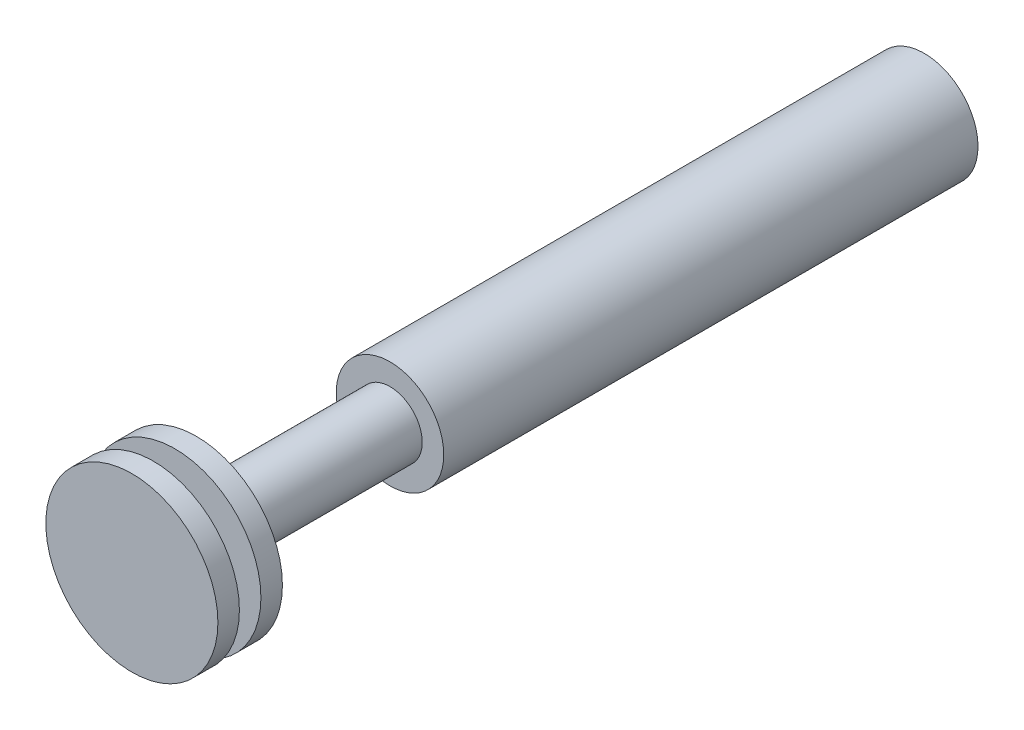
ISO-10303-21;
HEADER;
FILE_DESCRIPTION(('STEP AP214'),'2;1');
FILE_NAME('part.step','',(''),(''),'','','');
FILE_SCHEMA(('AUTOMOTIVE_DESIGN { 1 0 10303 214 1 1 1 1 }'));
ENDSEC;
DATA;
#1=APPLICATION_CONTEXT('core data for automotive mechanical design processes');
#2=APPLICATION_PROTOCOL_DEFINITION('international standard','automotive_design',2000,#1);
#3=PRODUCT_CONTEXT('',#1,'mechanical');
#4=PRODUCT('Part','Part','',(#3));
#5=PRODUCT_RELATED_PRODUCT_CATEGORY('part','',(#4));
#6=PRODUCT_DEFINITION_FORMATION('','',#4);
#7=PRODUCT_DEFINITION_CONTEXT('part definition',#1,'design');
#8=PRODUCT_DEFINITION('design','',#6,#7);
#9=PRODUCT_DEFINITION_SHAPE('','',#8);
#10=(LENGTH_UNIT() NAMED_UNIT(*) SI_UNIT(.MILLI.,.METRE.));
#11=(NAMED_UNIT(*) PLANE_ANGLE_UNIT() SI_UNIT($,.RADIAN.));
#12=(NAMED_UNIT(*) SI_UNIT($,.STERADIAN.) SOLID_ANGLE_UNIT());
#13=UNCERTAINTY_MEASURE_WITH_UNIT(LENGTH_MEASURE(1.E-05),#10,'distance_accuracy_value','');
#14=(GEOMETRIC_REPRESENTATION_CONTEXT(3) GLOBAL_UNCERTAINTY_ASSIGNED_CONTEXT((#13)) GLOBAL_UNIT_ASSIGNED_CONTEXT((#10,
#11,#12)) REPRESENTATION_CONTEXT('',''));
#15=CARTESIAN_POINT('',(0.,0.,0.));
#16=DIRECTION('',(0.,0.,1.));
#17=DIRECTION('',(1.,0.,0.));
#18=AXIS2_PLACEMENT_3D('',#15,#16,#17);
#19=CARTESIAN_POINT('',(0.,0.,184.));
#20=DIRECTION('',(0.,0.,1.));
#21=DIRECTION('',(1.,0.,0.));
#22=AXIS2_PLACEMENT_3D('',#19,#20,#21);
#23=PLANE('',#22);
#24=CARTESIAN_POINT('',(0.,0.,184.));
#25=DIRECTION('',(0.,0.,1.));
#26=DIRECTION('',(1.,0.,0.));
#27=AXIS2_PLACEMENT_3D('',#24,#25,#26);
#28=CIRCLE('',#27,8.);
#29=CARTESIAN_POINT('',(8.,0.,184.));
#30=VERTEX_POINT('',#29);
#31=EDGE_CURVE('E79',#30,#30,#28,.T.);
#32=ORIENTED_EDGE('',*,*,#31,.T.);
#33=EDGE_LOOP('',(#32));
#34=FACE_BOUND('',#33,.T.);
#35=ADVANCED_FACE('F43',(#34),#23,.T.);
#36=CARTESIAN_POINT('',(0.,0.,184.));
#37=DIRECTION('',(0.,0.,-1.));
#38=DIRECTION('',(-1.,0.,0.));
#39=AXIS2_PLACEMENT_3D('',#36,#37,#38);
#40=CYLINDRICAL_SURFACE('',#39,8.);
#41=ORIENTED_EDGE('',*,*,#31,.F.);
#42=EDGE_LOOP('',(#41));
#43=FACE_BOUND('',#42,.T.);
#44=CARTESIAN_POINT('',(0.,0.,182.));
#45=DIRECTION('',(0.,0.,1.));
#46=DIRECTION('',(1.,0.,0.));
#47=AXIS2_PLACEMENT_3D('',#44,#45,#46);
#48=CIRCLE('',#47,8.);
#49=CARTESIAN_POINT('',(8.,0.,182.));
#50=VERTEX_POINT('',#49);
#51=EDGE_CURVE('E73',#50,#50,#48,.T.);
#52=ORIENTED_EDGE('',*,*,#51,.T.);
#53=EDGE_LOOP('',(#52));
#54=FACE_BOUND('',#53,.T.);
#55=ADVANCED_FACE('F111',(#43,#54),#40,.T.);
#56=CARTESIAN_POINT('',(0.,0.,182.));
#57=DIRECTION('',(0.,0.,1.));
#58=DIRECTION('',(1.,0.,0.));
#59=AXIS2_PLACEMENT_3D('',#56,#57,#58);
#60=PLANE('',#59);
#61=CARTESIAN_POINT('',(0.,0.,182.));
#62=DIRECTION('',(0.,0.,1.));
#63=DIRECTION('',(1.,0.,0.));
#64=AXIS2_PLACEMENT_3D('',#61,#62,#63);
#65=CIRCLE('',#64,3.);
#66=CARTESIAN_POINT('',(3.,0.,182.));
#67=VERTEX_POINT('',#66);
#68=EDGE_CURVE('E62',#67,#67,#65,.T.);
#69=ORIENTED_EDGE('',*,*,#68,.T.);
#70=EDGE_LOOP('',(#69));
#71=FACE_BOUND('',#70,.T.);
#72=ORIENTED_EDGE('',*,*,#51,.F.);
#73=EDGE_LOOP('',(#72));
#74=FACE_BOUND('',#73,.T.);
#75=ADVANCED_FACE('F98',(#71,#74),#60,.F.);
#76=CARTESIAN_POINT('',(0.,0.,182.));
#77=DIRECTION('',(0.,0.,-1.));
#78=DIRECTION('',(-1.,0.,0.));
#79=AXIS2_PLACEMENT_3D('',#76,#77,#78);
#80=CYLINDRICAL_SURFACE('',#79,3.);
#81=ORIENTED_EDGE('',*,*,#68,.F.);
#82=EDGE_LOOP('',(#81));
#83=FACE_BOUND('',#82,.T.);
#84=CARTESIAN_POINT('',(0.,0.,180.));
#85=DIRECTION('',(0.,0.,1.));
#86=DIRECTION('',(1.,0.,0.));
#87=AXIS2_PLACEMENT_3D('',#84,#85,#86);
#88=CIRCLE('',#87,3.);
#89=CARTESIAN_POINT('',(3.,0.,180.));
#90=VERTEX_POINT('',#89);
#91=EDGE_CURVE('E10',#90,#90,#88,.T.);
#92=ORIENTED_EDGE('',*,*,#91,.T.);
#93=EDGE_LOOP('',(#92));
#94=FACE_BOUND('',#93,.T.);
#95=ADVANCED_FACE('F101',(#83,#94),#80,.T.);
#96=CARTESIAN_POINT('',(0.,0.,180.));
#97=DIRECTION('',(0.,0.,1.));
#98=DIRECTION('',(1.,0.,0.));
#99=AXIS2_PLACEMENT_3D('',#96,#97,#98);
#100=PLANE('',#99);
#101=ORIENTED_EDGE('',*,*,#91,.F.);
#102=EDGE_LOOP('',(#101));
#103=FACE_BOUND('',#102,.T.);
#104=CARTESIAN_POINT('',(0.,0.,180.));
#105=DIRECTION('',(0.,0.,1.));
#106=DIRECTION('',(1.,0.,0.));
#107=AXIS2_PLACEMENT_3D('',#104,#105,#106);
#108=CIRCLE('',#107,8.);
#109=CARTESIAN_POINT('',(8.,0.,180.));
#110=VERTEX_POINT('',#109);
#111=EDGE_CURVE('E67',#110,#110,#108,.T.);
#112=ORIENTED_EDGE('',*,*,#111,.T.);
#113=EDGE_LOOP('',(#112));
#114=FACE_BOUND('',#113,.T.);
#115=ADVANCED_FACE('F103',(#103,#114),#100,.T.);
#116=CARTESIAN_POINT('',(0.,0.,178.));
#117=DIRECTION('',(0.,0.,1.));
#118=DIRECTION('',(1.,0.,0.));
#119=AXIS2_PLACEMENT_3D('',#116,#117,#118);
#120=CYLINDRICAL_SURFACE('',#119,8.);
#121=CARTESIAN_POINT('',(0.,0.,178.));
#122=DIRECTION('',(0.,0.,1.));
#123=DIRECTION('',(1.,0.,0.));
#124=AXIS2_PLACEMENT_3D('',#121,#122,#123);
#125=CIRCLE('',#124,8.);
#126=CARTESIAN_POINT('',(8.,0.,178.));
#127=VERTEX_POINT('',#126);
#128=EDGE_CURVE('E58',#127,#127,#125,.T.);
#129=ORIENTED_EDGE('',*,*,#128,.T.);
#130=EDGE_LOOP('',(#129));
#131=FACE_BOUND('',#130,.T.);
#132=ORIENTED_EDGE('',*,*,#111,.F.);
#133=EDGE_LOOP('',(#132));
#134=FACE_BOUND('',#133,.T.);
#135=ADVANCED_FACE('F109',(#131,#134),#120,.T.);
#136=CARTESIAN_POINT('',(0.,0.,178.));
#137=DIRECTION('',(0.,0.,1.));
#138=DIRECTION('',(1.,0.,0.));
#139=AXIS2_PLACEMENT_3D('',#136,#137,#138);
#140=PLANE('',#139);
#141=CARTESIAN_POINT('',(0.,0.,178.));
#142=DIRECTION('',(0.,0.,1.));
#143=DIRECTION('',(1.,0.,0.));
#144=AXIS2_PLACEMENT_3D('',#141,#142,#143);
#145=CIRCLE('',#144,3.);
#146=CARTESIAN_POINT('',(-3.,0.,178.));
#147=VERTEX_POINT('',#146);
#148=EDGE_CURVE('E52',#147,#147,#145,.T.);
#149=ORIENTED_EDGE('',*,*,#148,.T.);
#150=EDGE_LOOP('',(#149));
#151=FACE_BOUND('',#150,.T.);
#152=ORIENTED_EDGE('',*,*,#128,.F.);
#153=EDGE_LOOP('',(#152));
#154=FACE_BOUND('',#153,.T.);
#155=ADVANCED_FACE('F136',(#151,#154),#140,.F.);
#156=CARTESIAN_POINT('',(0.,0.,180.));
#157=DIRECTION('',(0.,0.,-1.));
#158=DIRECTION('',(-1.,0.,0.));
#159=AXIS2_PLACEMENT_3D('',#156,#157,#158);
#160=CYLINDRICAL_SURFACE('',#159,3.);
#161=CARTESIAN_POINT('',(0.,0.,160.));
#162=DIRECTION('',(0.,0.,1.));
#163=DIRECTION('',(1.,0.,0.));
#164=AXIS2_PLACEMENT_3D('',#161,#162,#163);
#165=CIRCLE('',#164,3.);
#166=CARTESIAN_POINT('',(-3.,0.,160.));
#167=VERTEX_POINT('',#166);
#168=EDGE_CURVE('E47',#167,#167,#165,.T.);
#169=CARTESIAN_POINT('',(-3.,0.,160.));
#170=CARTESIAN_POINT('',(-3.,0.,160.1875));
#171=CARTESIAN_POINT('',(-3.,0.,160.375));
#172=CARTESIAN_POINT('',(-3.,0.,160.75));
#173=CARTESIAN_POINT('',(-3.,0.,160.9375));
#174=CARTESIAN_POINT('',(-3.,0.,161.3125));
#175=CARTESIAN_POINT('',(-3.,0.,161.5));
#176=CARTESIAN_POINT('',(-3.,0.,161.875));
#177=CARTESIAN_POINT('',(-3.,0.,162.0625));
#178=CARTESIAN_POINT('',(-3.,0.,162.4375));
#179=CARTESIAN_POINT('',(-3.,0.,162.625));
#180=CARTESIAN_POINT('',(-3.,0.,163.));
#181=CARTESIAN_POINT('',(-3.,0.,163.1875));
#182=CARTESIAN_POINT('',(-3.,0.,163.5625));
#183=CARTESIAN_POINT('',(-3.,0.,163.75));
#184=CARTESIAN_POINT('',(-3.,0.,164.125));
#185=CARTESIAN_POINT('',(-3.,0.,164.3125));
#186=CARTESIAN_POINT('',(-3.,0.,164.6875));
#187=CARTESIAN_POINT('',(-3.,0.,164.875));
#188=CARTESIAN_POINT('',(-3.,0.,165.25));
#189=CARTESIAN_POINT('',(-3.,0.,165.4375));
#190=CARTESIAN_POINT('',(-3.,0.,165.8125));
#191=CARTESIAN_POINT('',(-3.,0.,166.));
#192=CARTESIAN_POINT('',(-3.,0.,166.375));
#193=CARTESIAN_POINT('',(-3.,0.,166.5625));
#194=CARTESIAN_POINT('',(-3.,0.,166.9375));
#195=CARTESIAN_POINT('',(-3.,0.,167.125));
#196=CARTESIAN_POINT('',(-3.,0.,167.5));
#197=CARTESIAN_POINT('',(-3.,0.,167.6875));
#198=CARTESIAN_POINT('',(-3.,0.,168.0625));
#199=CARTESIAN_POINT('',(-3.,0.,168.25));
#200=CARTESIAN_POINT('',(-3.,0.,168.625));
#201=CARTESIAN_POINT('',(-3.,0.,168.8125));
#202=CARTESIAN_POINT('',(-3.,0.,169.1875));
#203=CARTESIAN_POINT('',(-3.,0.,169.375));
#204=CARTESIAN_POINT('',(-3.,0.,169.75));
#205=CARTESIAN_POINT('',(-3.,0.,169.9375));
#206=CARTESIAN_POINT('',(-3.,0.,170.3125));
#207=CARTESIAN_POINT('',(-3.,0.,170.5));
#208=CARTESIAN_POINT('',(-3.,0.,170.875));
#209=CARTESIAN_POINT('',(-3.,0.,171.0625));
#210=CARTESIAN_POINT('',(-3.,0.,171.4375));
#211=CARTESIAN_POINT('',(-3.,0.,171.625));
#212=CARTESIAN_POINT('',(-3.,0.,172.));
#213=CARTESIAN_POINT('',(-3.,0.,172.1875));
#214=CARTESIAN_POINT('',(-3.,0.,172.5625));
#215=CARTESIAN_POINT('',(-3.,0.,172.75));
#216=CARTESIAN_POINT('',(-3.,0.,173.125));
#217=CARTESIAN_POINT('',(-3.,0.,173.3125));
#218=CARTESIAN_POINT('',(-3.,0.,173.6875));
#219=CARTESIAN_POINT('',(-3.,0.,173.875));
#220=CARTESIAN_POINT('',(-3.,0.,174.25));
#221=CARTESIAN_POINT('',(-3.,0.,174.4375));
#222=CARTESIAN_POINT('',(-3.,0.,174.8125));
#223=CARTESIAN_POINT('',(-3.,0.,175.));
#224=CARTESIAN_POINT('',(-3.,0.,175.375));
#225=CARTESIAN_POINT('',(-3.,0.,175.5625));
#226=CARTESIAN_POINT('',(-3.,0.,175.9375));
#227=CARTESIAN_POINT('',(-3.,0.,176.125));
#228=CARTESIAN_POINT('',(-3.,0.,176.5));
#229=CARTESIAN_POINT('',(-3.,0.,176.6875));
#230=CARTESIAN_POINT('',(-3.,0.,177.0625));
#231=CARTESIAN_POINT('',(-3.,0.,177.25));
#232=CARTESIAN_POINT('',(-3.,0.,177.625));
#233=CARTESIAN_POINT('',(-3.,0.,177.8125));
#234=CARTESIAN_POINT('',(-3.,0.,178.));
#235=B_SPLINE_CURVE_WITH_KNOTS('',3,(#169,#170,#171,#172,#173,#174,#175,#176,#177,#178,#179,
#180,#181,#182,#183,#184,#185,#186,#187,#188,#189,#190,#191,#192,#193,#194,#195,#196,#197,#198,
#199,#200,#201,#202,#203,#204,#205,#206,#207,#208,#209,#210,#211,#212,#213,#214,#215,#216,#217,
#218,#219,#220,#221,#222,#223,#224,#225,#226,#227,#228,#229,#230,#231,#232,#233,#234),
.UNSPECIFIED.,.F.,.F.,(4,2,2,2,2,2,2,2,2,2,2,2,2,2,2,2,2,2,2,2,2,2,2,2,2,2,2,2,2,2,2,2,4),(0.,
0.562499999999994,1.12499999999999,1.68749999999998,2.25,2.8125,3.37499999999999,
3.93749999999998,4.49999999999998,5.0625,5.62499999999999,6.18749999999998,6.74999999999998,
7.31249999999997,7.87499999999999,8.43749999999999,8.99999999999998,9.56249999999997,10.125,
10.6875,11.25,11.8125,12.375,12.9375,13.5,14.0625,14.625,15.1875,15.75,16.3125,16.875,17.4375,
18.),.UNSPECIFIED.);
#236=EDGE_CURVE('BSEAM45',#167,#147,#235,.T.);
#237=ORIENTED_EDGE('',*,*,#168,.T.);
#238=ORIENTED_EDGE('',*,*,#148,.F.);
#239=ORIENTED_EDGE('',*,*,#236,.T.);
#240=ORIENTED_EDGE('',*,*,#236,.F.);
#241=EDGE_LOOP('',(#237,#239,#238,#240));
#242=FACE_BOUND('',#241,.T.);
#243=ADVANCED_FACE('F45',(#242),#160,.T.);
#244=CARTESIAN_POINT('',(0.,0.,160.));
#245=DIRECTION('',(0.,0.,1.));
#246=DIRECTION('',(1.,0.,0.));
#247=AXIS2_PLACEMENT_3D('',#244,#245,#246);
#248=PLANE('',#247);
#249=ORIENTED_EDGE('',*,*,#168,.F.);
#250=EDGE_LOOP('',(#249));
#251=FACE_BOUND('',#250,.T.);
#252=CARTESIAN_POINT('',(0.,0.,160.));
#253=DIRECTION('',(0.,0.,1.));
#254=DIRECTION('',(1.,0.,0.));
#255=AXIS2_PLACEMENT_3D('',#252,#253,#254);
#256=CIRCLE('',#255,5.);
#257=CARTESIAN_POINT('',(5.,0.,160.));
#258=VERTEX_POINT('',#257);
#259=EDGE_CURVE('E81',#258,#258,#256,.T.);
#260=ORIENTED_EDGE('',*,*,#259,.T.);
#261=EDGE_LOOP('',(#260));
#262=FACE_BOUND('',#261,.T.);
#263=ADVANCED_FACE('F129',(#251,#262),#248,.T.);
#264=CARTESIAN_POINT('',(-8.,22.8607152885849,110.320831594816));
#265=DIRECTION('',(0.,0.,1.));
#266=DIRECTION('',(1.,0.,0.));
#267=AXIS2_PLACEMENT_3D('',#264,#265,#266);
#268=PLANE('',#267);
#269=CARTESIAN_POINT('',(0.,0.,110.320831594816));
#270=DIRECTION('',(0.,0.,1.));
#271=DIRECTION('',(1.,0.,0.));
#272=AXIS2_PLACEMENT_3D('',#269,#270,#271);
#273=CIRCLE('',#272,5.);
#274=CARTESIAN_POINT('',(5.,0.,110.320831594816));
#275=VERTEX_POINT('',#274);
#276=EDGE_CURVE('E70',#275,#275,#273,.F.);
#277=ORIENTED_EDGE('',*,*,#276,.T.);
#278=EDGE_LOOP('',(#277));
#279=FACE_BOUND('',#278,.T.);
#280=ADVANCED_FACE('F125',(#279),#268,.F.);
#281=CARTESIAN_POINT('',(0.,0.,60.));
#282=DIRECTION('',(0.,0.,1.));
#283=DIRECTION('',(1.,0.,0.));
#284=AXIS2_PLACEMENT_3D('',#281,#282,#283);
#285=CYLINDRICAL_SURFACE('',#284,5.);
#286=ORIENTED_EDGE('',*,*,#276,.F.);
#287=EDGE_LOOP('',(#286));
#288=FACE_BOUND('',#287,.T.);
#289=ORIENTED_EDGE('',*,*,#259,.F.);
#290=EDGE_LOOP('',(#289));
#291=FACE_BOUND('',#290,.T.);
#292=ADVANCED_FACE('F122',(#288,#291),#285,.T.);
#293=CLOSED_SHELL('',(#35,#55,#75,#95,#115,#135,#155,#243,#263,#280,#292));
#294=MANIFOLD_SOLID_BREP('B2',#293);
#295=ADVANCED_BREP_SHAPE_REPRESENTATION('',(#18,#294),#14);
#296=SHAPE_DEFINITION_REPRESENTATION(#9,#295);
ENDSEC;
END-ISO-10303-21;
